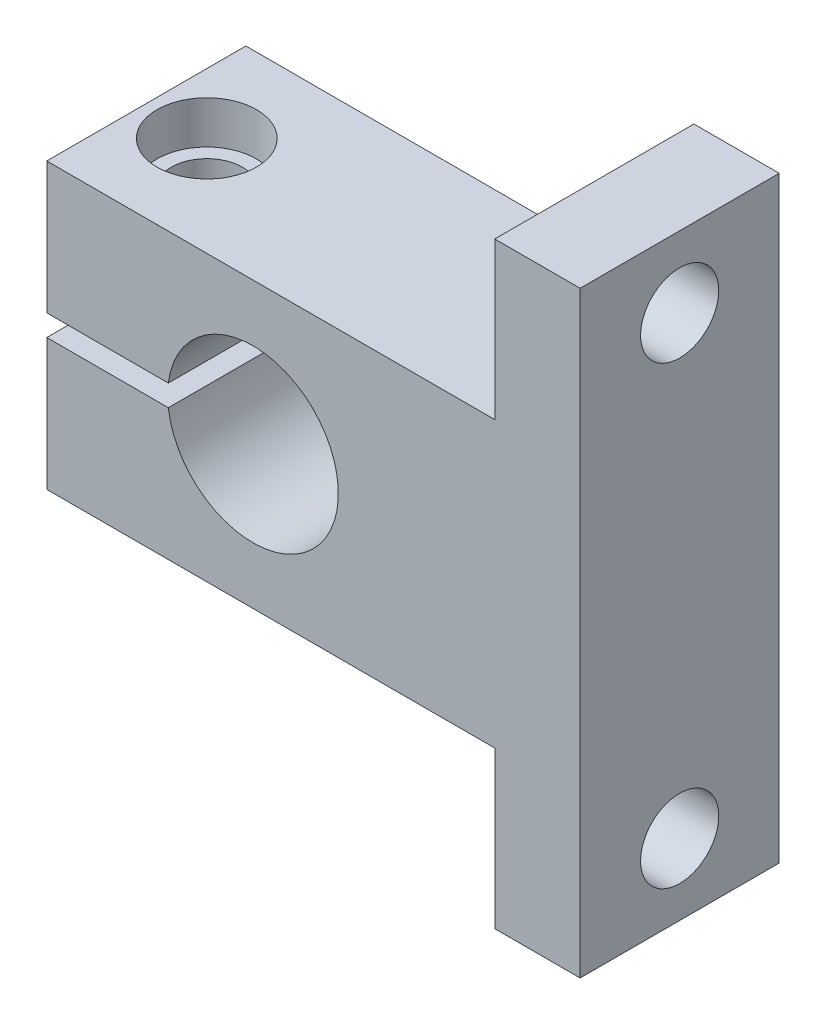
ISO-10303-21;
HEADER;
FILE_DESCRIPTION(('STEP AP214'),'2;1');
FILE_NAME('part.step','',(''),(''),'','','');
FILE_SCHEMA(('AUTOMOTIVE_DESIGN { 1 0 10303 214 1 1 1 1 }'));
ENDSEC;
DATA;
#1=APPLICATION_CONTEXT('core data for automotive mechanical design processes');
#2=APPLICATION_PROTOCOL_DEFINITION('international standard','automotive_design',2000,#1);
#3=PRODUCT_CONTEXT('',#1,'mechanical');
#4=PRODUCT('Part','Part','',(#3));
#5=PRODUCT_RELATED_PRODUCT_CATEGORY('part','',(#4));
#6=PRODUCT_DEFINITION_FORMATION('','',#4);
#7=PRODUCT_DEFINITION_CONTEXT('part definition',#1,'design');
#8=PRODUCT_DEFINITION('design','',#6,#7);
#9=PRODUCT_DEFINITION_SHAPE('','',#8);
#10=(LENGTH_UNIT() NAMED_UNIT(*) SI_UNIT(.MILLI.,.METRE.));
#11=(NAMED_UNIT(*) PLANE_ANGLE_UNIT() SI_UNIT($,.RADIAN.));
#12=(NAMED_UNIT(*) SI_UNIT($,.STERADIAN.) SOLID_ANGLE_UNIT());
#13=UNCERTAINTY_MEASURE_WITH_UNIT(LENGTH_MEASURE(1.E-05),#10,'distance_accuracy_value','');
#14=(GEOMETRIC_REPRESENTATION_CONTEXT(3) GLOBAL_UNCERTAINTY_ASSIGNED_CONTEXT((#13)) GLOBAL_UNIT_ASSIGNED_CONTEXT((#10,
#11,#12)) REPRESENTATION_CONTEXT('',''));
#15=CARTESIAN_POINT('',(0.,0.,0.));
#16=DIRECTION('',(0.,0.,1.));
#17=DIRECTION('',(1.,0.,0.));
#18=AXIS2_PLACEMENT_3D('',#15,#16,#17);
#19=CARTESIAN_POINT('',(-33.25,-0.001000000000001,7.));
#20=DIRECTION('',(0.,1.,0.));
#21=DIRECTION('',(0.,0.,1.));
#22=AXIS2_PLACEMENT_3D('',#19,#20,#21);
#23=CYLINDRICAL_SURFACE('',#22,2.5);
#24=CARTESIAN_POINT('',(-33.25,21.75,7.));
#25=DIRECTION('',(0.,1.,0.));
#26=DIRECTION('',(0.,0.,1.));
#27=AXIS2_PLACEMENT_3D('',#24,#25,#26);
#28=CIRCLE('',#27,2.5);
#29=CARTESIAN_POINT('',(-33.25,21.75,9.5));
#30=VERTEX_POINT('',#29);
#31=EDGE_CURVE('E165',#30,#30,#28,.F.);
#32=ORIENTED_EDGE('',*,*,#31,.T.);
#33=EDGE_LOOP('',(#32));
#34=FACE_BOUND('',#33,.T.);
#35=CARTESIAN_POINT('',(-33.25,28.,7.));
#36=DIRECTION('',(0.,1.,0.));
#37=DIRECTION('',(0.,0.,1.));
#38=AXIS2_PLACEMENT_3D('',#35,#36,#37);
#39=CIRCLE('',#38,2.5);
#40=CARTESIAN_POINT('',(-33.25,28.,9.5));
#41=VERTEX_POINT('',#40);
#42=EDGE_CURVE('E43',#41,#41,#39,.F.);
#43=ORIENTED_EDGE('',*,*,#42,.F.);
#44=EDGE_LOOP('',(#43));
#45=FACE_BOUND('',#44,.T.);
#46=ADVANCED_FACE('F39',(#34,#45),#23,.F.);
#47=CARTESIAN_POINT('',(-6.,0.,14.));
#48=DIRECTION('',(0.,1.,0.));
#49=DIRECTION('',(0.,0.,1.));
#50=AXIS2_PLACEMENT_3D('',#47,#48,#49);
#51=PLANE('',#50);
#52=DIRECTION('',(1.,0.,0.));
#53=VECTOR('',#52,1.);
#54=CARTESIAN_POINT('',(-6.,0.,0.));
#55=LINE('',#54,#53);
#56=CARTESIAN_POINT('',(-6.,0.,0.));
#57=VERTEX_POINT('',#56);
#58=CARTESIAN_POINT('',(0.,0.,0.));
#59=VERTEX_POINT('',#58);
#60=EDGE_CURVE('E161',#57,#59,#55,.T.);
#61=ORIENTED_EDGE('',*,*,#60,.T.);
#62=DIRECTION('',(0.,0.,-1.));
#63=VECTOR('',#62,1.);
#64=CARTESIAN_POINT('',(0.,0.,14.));
#65=LINE('',#64,#63);
#66=CARTESIAN_POINT('',(0.,0.,14.));
#67=VERTEX_POINT('',#66);
#68=EDGE_CURVE('E11',#67,#59,#65,.T.);
#69=ORIENTED_EDGE('',*,*,#68,.F.);
#70=DIRECTION('',(1.,0.,0.));
#71=VECTOR('',#70,1.);
#72=CARTESIAN_POINT('',(-6.,0.,14.));
#73=LINE('',#72,#71);
#74=CARTESIAN_POINT('',(-6.,0.,14.));
#75=VERTEX_POINT('',#74);
#76=EDGE_CURVE('E184',#75,#67,#73,.T.);
#77=ORIENTED_EDGE('',*,*,#76,.F.);
#78=DIRECTION('',(0.,0.,-1.));
#79=VECTOR('',#78,1.);
#80=CARTESIAN_POINT('',(-6.,0.,14.));
#81=LINE('',#80,#79);
#82=EDGE_CURVE('E157',#75,#57,#81,.T.);
#83=ORIENTED_EDGE('',*,*,#82,.T.);
#84=EDGE_LOOP('',(#61,#69,#77,#83));
#85=FACE_BOUND('',#84,.T.);
#86=ADVANCED_FACE('F41',(#85),#51,.F.);
#87=CARTESIAN_POINT('',(0.,0.,14.));
#88=DIRECTION('',(-1.,0.,0.));
#89=DIRECTION('',(0.,0.,1.));
#90=AXIS2_PLACEMENT_3D('',#87,#88,#89);
#91=PLANE('',#90);
#92=CARTESIAN_POINT('',(0.,5.,7.));
#93=DIRECTION('',(-1.,0.,0.));
#94=DIRECTION('',(0.,-1.,0.));
#95=AXIS2_PLACEMENT_3D('',#92,#93,#94);
#96=CIRCLE('',#95,2.75);
#97=CARTESIAN_POINT('',(0.,2.25,7.));
#98=VERTEX_POINT('',#97);
#99=EDGE_CURVE('E305',#98,#98,#96,.T.);
#100=ORIENTED_EDGE('',*,*,#99,.T.);
#101=EDGE_LOOP('',(#100));
#102=FACE_BOUND('',#101,.T.);
#103=CARTESIAN_POINT('',(0.,37.,7.));
#104=DIRECTION('',(-1.,0.,0.));
#105=DIRECTION('',(0.,-1.,0.));
#106=AXIS2_PLACEMENT_3D('',#103,#104,#105);
#107=CIRCLE('',#106,2.75);
#108=CARTESIAN_POINT('',(0.,34.25,7.));
#109=VERTEX_POINT('',#108);
#110=EDGE_CURVE('E297',#109,#109,#107,.T.);
#111=ORIENTED_EDGE('',*,*,#110,.T.);
#112=EDGE_LOOP('',(#111));
#113=FACE_BOUND('',#112,.T.);
#114=DIRECTION('',(0.,1.,0.));
#115=VECTOR('',#114,1.);
#116=CARTESIAN_POINT('',(0.,0.,0.));
#117=LINE('',#116,#115);
#118=CARTESIAN_POINT('',(0.,42.,0.));
#119=VERTEX_POINT('',#118);
#120=EDGE_CURVE('E164',#59,#119,#117,.T.);
#121=ORIENTED_EDGE('',*,*,#120,.T.);
#122=DIRECTION('',(0.,0.,-1.));
#123=VECTOR('',#122,1.);
#124=CARTESIAN_POINT('',(0.,42.,14.));
#125=LINE('',#124,#123);
#126=CARTESIAN_POINT('',(0.,42.,14.));
#127=VERTEX_POINT('',#126);
#128=EDGE_CURVE('E49',#127,#119,#125,.T.);
#129=ORIENTED_EDGE('',*,*,#128,.F.);
#130=DIRECTION('',(0.,1.,0.));
#131=VECTOR('',#130,1.);
#132=CARTESIAN_POINT('',(0.,0.,14.));
#133=LINE('',#132,#131);
#134=EDGE_CURVE('E112',#67,#127,#133,.T.);
#135=ORIENTED_EDGE('',*,*,#134,.F.);
#136=ORIENTED_EDGE('',*,*,#68,.T.);
#137=EDGE_LOOP('',(#121,#129,#135,#136));
#138=FACE_BOUND('',#137,.T.);
#139=ADVANCED_FACE('F271',(#102,#113,#138),#91,.F.);
#140=CARTESIAN_POINT('',(0.,42.,14.));
#141=DIRECTION('',(0.,-1.,0.));
#142=DIRECTION('',(0.,0.,-1.));
#143=AXIS2_PLACEMENT_3D('',#140,#141,#142);
#144=PLANE('',#143);
#145=DIRECTION('',(-1.,0.,0.));
#146=VECTOR('',#145,1.);
#147=CARTESIAN_POINT('',(0.,42.,0.));
#148=LINE('',#147,#146);
#149=CARTESIAN_POINT('',(-6.,42.,0.));
#150=VERTEX_POINT('',#149);
#151=EDGE_CURVE('E167',#119,#150,#148,.T.);
#152=ORIENTED_EDGE('',*,*,#151,.T.);
#153=DIRECTION('',(0.,0.,-1.));
#154=VECTOR('',#153,1.);
#155=CARTESIAN_POINT('',(-6.,42.,14.));
#156=LINE('',#155,#154);
#157=CARTESIAN_POINT('',(-6.,42.,14.));
#158=VERTEX_POINT('',#157);
#159=EDGE_CURVE('E203',#158,#150,#156,.T.);
#160=ORIENTED_EDGE('',*,*,#159,.F.);
#161=DIRECTION('',(-1.,0.,0.));
#162=VECTOR('',#161,1.);
#163=CARTESIAN_POINT('',(0.,42.,14.));
#164=LINE('',#163,#162);
#165=EDGE_CURVE('E212',#127,#158,#164,.T.);
#166=ORIENTED_EDGE('',*,*,#165,.F.);
#167=ORIENTED_EDGE('',*,*,#128,.T.);
#168=EDGE_LOOP('',(#152,#160,#166,#167));
#169=FACE_BOUND('',#168,.T.);
#170=ADVANCED_FACE('F210',(#169),#144,.F.);
#171=CARTESIAN_POINT('',(-6.,42.,14.));
#172=DIRECTION('',(1.,0.,0.));
#173=DIRECTION('',(0.,1.,0.));
#174=AXIS2_PLACEMENT_3D('',#171,#172,#173);
#175=PLANE('',#174);
#176=CARTESIAN_POINT('',(-6.00000000000001,37.,7.));
#177=DIRECTION('',(-1.,0.,0.));
#178=DIRECTION('',(0.,-1.,0.));
#179=AXIS2_PLACEMENT_3D('',#176,#177,#178);
#180=CIRCLE('',#179,2.75);
#181=CARTESIAN_POINT('',(-6.00000000000001,34.25,7.));
#182=VERTEX_POINT('',#181);
#183=EDGE_CURVE('E302',#182,#182,#180,.T.);
#184=ORIENTED_EDGE('',*,*,#183,.F.);
#185=EDGE_LOOP('',(#184));
#186=FACE_BOUND('',#185,.T.);
#187=DIRECTION('',(0.,-1.,0.));
#188=VECTOR('',#187,1.);
#189=CARTESIAN_POINT('',(-6.,42.,0.));
#190=LINE('',#189,#188);
#191=CARTESIAN_POINT('',(-6.,31.,0.));
#192=VERTEX_POINT('',#191);
#193=EDGE_CURVE('E169',#150,#192,#190,.T.);
#194=ORIENTED_EDGE('',*,*,#193,.T.);
#195=DIRECTION('',(0.,0.,-1.));
#196=VECTOR('',#195,1.);
#197=CARTESIAN_POINT('',(-6.,31.,14.));
#198=LINE('',#197,#196);
#199=CARTESIAN_POINT('',(-6.,31.,14.));
#200=VERTEX_POINT('',#199);
#201=EDGE_CURVE('E200',#200,#192,#198,.T.);
#202=ORIENTED_EDGE('',*,*,#201,.F.);
#203=DIRECTION('',(0.,-1.,0.));
#204=VECTOR('',#203,1.);
#205=CARTESIAN_POINT('',(-6.,42.,14.));
#206=LINE('',#205,#204);
#207=EDGE_CURVE('E230',#158,#200,#206,.T.);
#208=ORIENTED_EDGE('',*,*,#207,.F.);
#209=ORIENTED_EDGE('',*,*,#159,.T.);
#210=EDGE_LOOP('',(#194,#202,#208,#209));
#211=FACE_BOUND('',#210,.T.);
#212=ADVANCED_FACE('F221',(#186,#211),#175,.F.);
#213=CARTESIAN_POINT('',(-6.,31.,14.));
#214=DIRECTION('',(0.,-1.,0.));
#215=DIRECTION('',(1.,0.,0.));
#216=AXIS2_PLACEMENT_3D('',#213,#214,#215);
#217=PLANE('',#216);
#218=CARTESIAN_POINT('',(-33.25,31.,7.));
#219=DIRECTION('',(0.,1.,0.));
#220=DIRECTION('',(0.,0.,1.));
#221=AXIS2_PLACEMENT_3D('',#218,#219,#220);
#222=CIRCLE('',#221,3.5);
#223=CARTESIAN_POINT('',(-33.25,31.,10.5));
#224=VERTEX_POINT('',#223);
#225=EDGE_CURVE('E313',#224,#224,#222,.T.);
#226=ORIENTED_EDGE('',*,*,#225,.F.);
#227=EDGE_LOOP('',(#226));
#228=FACE_BOUND('',#227,.T.);
#229=DIRECTION('',(-1.,0.,0.));
#230=VECTOR('',#229,1.);
#231=CARTESIAN_POINT('',(-6.,31.,0.));
#232=LINE('',#231,#230);
#233=CARTESIAN_POINT('',(-37.5,31.,0.));
#234=VERTEX_POINT('',#233);
#235=EDGE_CURVE('E171',#192,#234,#232,.T.);
#236=ORIENTED_EDGE('',*,*,#235,.T.);
#237=DIRECTION('',(0.,0.,-1.));
#238=VECTOR('',#237,1.);
#239=CARTESIAN_POINT('',(-37.5,31.,14.));
#240=LINE('',#239,#238);
#241=CARTESIAN_POINT('',(-37.5,31.,14.));
#242=VERTEX_POINT('',#241);
#243=EDGE_CURVE('E197',#242,#234,#240,.T.);
#244=ORIENTED_EDGE('',*,*,#243,.F.);
#245=DIRECTION('',(-1.,0.,0.));
#246=VECTOR('',#245,1.);
#247=CARTESIAN_POINT('',(-6.,31.,14.));
#248=LINE('',#247,#246);
#249=EDGE_CURVE('E227',#200,#242,#248,.T.);
#250=ORIENTED_EDGE('',*,*,#249,.F.);
#251=ORIENTED_EDGE('',*,*,#201,.T.);
#252=EDGE_LOOP('',(#236,#244,#250,#251));
#253=FACE_BOUND('',#252,.T.);
#254=ADVANCED_FACE('F225',(#228,#253),#217,.F.);
#255=CARTESIAN_POINT('',(-37.5,31.,14.));
#256=DIRECTION('',(1.,0.,0.));
#257=DIRECTION('',(0.,0.,-1.));
#258=AXIS2_PLACEMENT_3D('',#255,#256,#257);
#259=PLANE('',#258);
#260=DIRECTION('',(0.,-1.,0.));
#261=VECTOR('',#260,1.);
#262=CARTESIAN_POINT('',(-37.5,31.,0.));
#263=LINE('',#262,#261);
#264=CARTESIAN_POINT('',(-37.5,21.75,0.));
#265=VERTEX_POINT('',#264);
#266=EDGE_CURVE('E173',#234,#265,#263,.T.);
#267=ORIENTED_EDGE('',*,*,#266,.T.);
#268=DIRECTION('',(0.,0.,-1.));
#269=VECTOR('',#268,1.);
#270=CARTESIAN_POINT('',(-37.5,21.75,14.));
#271=LINE('',#270,#269);
#272=CARTESIAN_POINT('',(-37.5,21.75,14.));
#273=VERTEX_POINT('',#272);
#274=EDGE_CURVE('E194',#273,#265,#271,.T.);
#275=ORIENTED_EDGE('',*,*,#274,.F.);
#276=DIRECTION('',(0.,-1.,0.));
#277=VECTOR('',#276,1.);
#278=CARTESIAN_POINT('',(-37.5,31.,14.));
#279=LINE('',#278,#277);
#280=EDGE_CURVE('E229',#242,#273,#279,.T.);
#281=ORIENTED_EDGE('',*,*,#280,.F.);
#282=ORIENTED_EDGE('',*,*,#243,.T.);
#283=EDGE_LOOP('',(#267,#275,#281,#282));
#284=FACE_BOUND('',#283,.T.);
#285=ADVANCED_FACE('F352',(#284),#259,.F.);
#286=CARTESIAN_POINT('',(-37.5,21.75,14.));
#287=DIRECTION('',(0.,1.,0.));
#288=DIRECTION('',(0.,0.,1.));
#289=AXIS2_PLACEMENT_3D('',#286,#287,#288);
#290=PLANE('',#289);
#291=ORIENTED_EDGE('',*,*,#31,.F.);
#292=EDGE_LOOP('',(#291));
#293=FACE_BOUND('',#292,.T.);
#294=DIRECTION('',(1.,0.,0.));
#295=VECTOR('',#294,1.);
#296=CARTESIAN_POINT('',(-37.5,21.75,0.));
#297=LINE('',#296,#295);
#298=CARTESIAN_POINT('',(-28.9529404498953,21.75,0.));
#299=VERTEX_POINT('',#298);
#300=EDGE_CURVE('E175',#265,#299,#297,.T.);
#301=ORIENTED_EDGE('',*,*,#300,.T.);
#302=DIRECTION('',(0.,0.,-1.));
#303=VECTOR('',#302,1.);
#304=CARTESIAN_POINT('',(-28.9529404498953,21.75,14.));
#305=LINE('',#304,#303);
#306=CARTESIAN_POINT('',(-28.9529404498953,21.75,14.));
#307=VERTEX_POINT('',#306);
#308=EDGE_CURVE('E191',#307,#299,#305,.T.);
#309=ORIENTED_EDGE('',*,*,#308,.F.);
#310=DIRECTION('',(1.,0.,0.));
#311=VECTOR('',#310,1.);
#312=CARTESIAN_POINT('',(-37.5,21.75,14.));
#313=LINE('',#312,#311);
#314=EDGE_CURVE('E232',#273,#307,#313,.T.);
#315=ORIENTED_EDGE('',*,*,#314,.F.);
#316=ORIENTED_EDGE('',*,*,#274,.T.);
#317=EDGE_LOOP('',(#301,#309,#315,#316));
#318=FACE_BOUND('',#317,.T.);
#319=ADVANCED_FACE('F359',(#293,#318),#290,.F.);
#320=CARTESIAN_POINT('',(-23.,21.,14.));
#321=DIRECTION('',(0.,0.,-1.));
#322=DIRECTION('',(-1.,0.,0.));
#323=AXIS2_PLACEMENT_3D('',#320,#321,#322);
#324=CYLINDRICAL_SURFACE('',#323,6.);
#325=CARTESIAN_POINT('',(-23.,21.,0.));
#326=DIRECTION('',(0.,0.,-1.));
#327=DIRECTION('',(1.,0.,0.));
#328=AXIS2_PLACEMENT_3D('',#325,#326,#327);
#329=CIRCLE('',#328,6.);
#330=CARTESIAN_POINT('',(-28.9529404498953,20.25,0.));
#331=VERTEX_POINT('',#330);
#332=EDGE_CURVE('E177',#299,#331,#329,.T.);
#333=ORIENTED_EDGE('',*,*,#332,.T.);
#334=DIRECTION('',(0.,0.,-1.));
#335=VECTOR('',#334,1.);
#336=CARTESIAN_POINT('',(-28.9529404498953,20.25,14.));
#337=LINE('',#336,#335);
#338=CARTESIAN_POINT('',(-28.9529404498953,20.25,14.));
#339=VERTEX_POINT('',#338);
#340=EDGE_CURVE('E188',#339,#331,#337,.T.);
#341=ORIENTED_EDGE('',*,*,#340,.F.);
#342=CARTESIAN_POINT('',(-23.,21.,14.));
#343=DIRECTION('',(0.,0.,-1.));
#344=DIRECTION('',(1.,0.,0.));
#345=AXIS2_PLACEMENT_3D('',#342,#343,#344);
#346=CIRCLE('',#345,6.);
#347=EDGE_CURVE('E238',#307,#339,#346,.T.);
#348=ORIENTED_EDGE('',*,*,#347,.F.);
#349=ORIENTED_EDGE('',*,*,#308,.T.);
#350=EDGE_LOOP('',(#333,#341,#348,#349));
#351=FACE_BOUND('',#350,.T.);
#352=ADVANCED_FACE('F244',(#351),#324,.F.);
#353=CARTESIAN_POINT('',(-37.5,20.25,14.));
#354=DIRECTION('',(0.,-1.,0.));
#355=DIRECTION('',(0.,0.,-1.));
#356=AXIS2_PLACEMENT_3D('',#353,#354,#355);
#357=PLANE('',#356);
#358=CARTESIAN_POINT('',(-33.25,20.25,7.));
#359=DIRECTION('',(0.,1.,0.));
#360=DIRECTION('',(0.,0.,1.));
#361=AXIS2_PLACEMENT_3D('',#358,#359,#360);
#362=CIRCLE('',#361,1.65);
#363=CARTESIAN_POINT('',(-33.25,20.25,8.65));
#364=VERTEX_POINT('',#363);
#365=EDGE_CURVE('E291',#364,#364,#362,.T.);
#366=ORIENTED_EDGE('',*,*,#365,.F.);
#367=EDGE_LOOP('',(#366));
#368=FACE_BOUND('',#367,.T.);
#369=DIRECTION('',(-1.,0.,0.));
#370=VECTOR('',#369,1.);
#371=CARTESIAN_POINT('',(-37.5,20.25,0.));
#372=LINE('',#371,#370);
#373=CARTESIAN_POINT('',(-37.5,20.25,0.));
#374=VERTEX_POINT('',#373);
#375=EDGE_CURVE('E179',#331,#374,#372,.T.);
#376=ORIENTED_EDGE('',*,*,#375,.T.);
#377=DIRECTION('',(0.,0.,-1.));
#378=VECTOR('',#377,1.);
#379=CARTESIAN_POINT('',(-37.5,20.25,14.));
#380=LINE('',#379,#378);
#381=CARTESIAN_POINT('',(-37.5,20.25,14.));
#382=VERTEX_POINT('',#381);
#383=EDGE_CURVE('E152',#382,#374,#380,.T.);
#384=ORIENTED_EDGE('',*,*,#383,.F.);
#385=DIRECTION('',(-1.,0.,0.));
#386=VECTOR('',#385,1.);
#387=CARTESIAN_POINT('',(-37.5,20.25,14.));
#388=LINE('',#387,#386);
#389=EDGE_CURVE('E143',#339,#382,#388,.T.);
#390=ORIENTED_EDGE('',*,*,#389,.F.);
#391=ORIENTED_EDGE('',*,*,#340,.T.);
#392=EDGE_LOOP('',(#376,#384,#390,#391));
#393=FACE_BOUND('',#392,.T.);
#394=ADVANCED_FACE('F248',(#368,#393),#357,.F.);
#395=CARTESIAN_POINT('',(-37.5,20.25,14.));
#396=DIRECTION('',(1.,0.,0.));
#397=DIRECTION('',(0.,0.,-1.));
#398=AXIS2_PLACEMENT_3D('',#395,#396,#397);
#399=PLANE('',#398);
#400=DIRECTION('',(0.,-1.,0.));
#401=VECTOR('',#400,1.);
#402=CARTESIAN_POINT('',(-37.5,20.25,0.));
#403=LINE('',#402,#401);
#404=CARTESIAN_POINT('',(-37.5,11.,0.));
#405=VERTEX_POINT('',#404);
#406=EDGE_CURVE('E151',#374,#405,#403,.T.);
#407=ORIENTED_EDGE('',*,*,#406,.T.);
#408=DIRECTION('',(0.,0.,-1.));
#409=VECTOR('',#408,1.);
#410=CARTESIAN_POINT('',(-37.5,11.,14.));
#411=LINE('',#410,#409);
#412=CARTESIAN_POINT('',(-37.5,11.,14.));
#413=VERTEX_POINT('',#412);
#414=EDGE_CURVE('E148',#413,#405,#411,.T.);
#415=ORIENTED_EDGE('',*,*,#414,.F.);
#416=DIRECTION('',(0.,-1.,0.));
#417=VECTOR('',#416,1.);
#418=CARTESIAN_POINT('',(-37.5,20.25,14.));
#419=LINE('',#418,#417);
#420=EDGE_CURVE('E137',#382,#413,#419,.T.);
#421=ORIENTED_EDGE('',*,*,#420,.F.);
#422=ORIENTED_EDGE('',*,*,#383,.T.);
#423=EDGE_LOOP('',(#407,#415,#421,#422));
#424=FACE_BOUND('',#423,.T.);
#425=ADVANCED_FACE('F149',(#424),#399,.F.);
#426=CARTESIAN_POINT('',(-37.5,11.,14.));
#427=DIRECTION('',(0.,1.,0.));
#428=DIRECTION('',(0.,0.,1.));
#429=AXIS2_PLACEMENT_3D('',#426,#427,#428);
#430=PLANE('',#429);
#431=CARTESIAN_POINT('',(-33.25,11.,7.));
#432=DIRECTION('',(0.,1.,0.));
#433=DIRECTION('',(0.,0.,1.));
#434=AXIS2_PLACEMENT_3D('',#431,#432,#433);
#435=CIRCLE('',#434,1.65);
#436=CARTESIAN_POINT('',(-33.25,11.,8.65));
#437=VERTEX_POINT('',#436);
#438=EDGE_CURVE('E294',#437,#437,#435,.T.);
#439=ORIENTED_EDGE('',*,*,#438,.T.);
#440=EDGE_LOOP('',(#439));
#441=FACE_BOUND('',#440,.T.);
#442=DIRECTION('',(1.,0.,0.));
#443=VECTOR('',#442,1.);
#444=CARTESIAN_POINT('',(-37.5,11.,0.));
#445=LINE('',#444,#443);
#446=CARTESIAN_POINT('',(-6.,11.,0.));
#447=VERTEX_POINT('',#446);
#448=EDGE_CURVE('E98',#405,#447,#445,.T.);
#449=ORIENTED_EDGE('',*,*,#448,.T.);
#450=DIRECTION('',(0.,0.,-1.));
#451=VECTOR('',#450,1.);
#452=CARTESIAN_POINT('',(-6.,11.,14.));
#453=LINE('',#452,#451);
#454=CARTESIAN_POINT('',(-6.,11.,14.));
#455=VERTEX_POINT('',#454);
#456=EDGE_CURVE('E153',#455,#447,#453,.T.);
#457=ORIENTED_EDGE('',*,*,#456,.F.);
#458=DIRECTION('',(1.,0.,0.));
#459=VECTOR('',#458,1.);
#460=CARTESIAN_POINT('',(-37.5,11.,14.));
#461=LINE('',#460,#459);
#462=EDGE_CURVE('E141',#413,#455,#461,.T.);
#463=ORIENTED_EDGE('',*,*,#462,.F.);
#464=ORIENTED_EDGE('',*,*,#414,.T.);
#465=EDGE_LOOP('',(#449,#457,#463,#464));
#466=FACE_BOUND('',#465,.T.);
#467=ADVANCED_FACE('F155',(#441,#466),#430,.F.);
#468=CARTESIAN_POINT('',(-6.,11.,14.));
#469=DIRECTION('',(1.,0.,0.));
#470=DIRECTION('',(0.,1.,0.));
#471=AXIS2_PLACEMENT_3D('',#468,#469,#470);
#472=PLANE('',#471);
#473=CARTESIAN_POINT('',(-6.,5.,7.));
#474=DIRECTION('',(-1.,0.,0.));
#475=DIRECTION('',(0.,-1.,0.));
#476=AXIS2_PLACEMENT_3D('',#473,#474,#475);
#477=CIRCLE('',#476,2.75);
#478=CARTESIAN_POINT('',(-6.,2.25,7.));
#479=VERTEX_POINT('',#478);
#480=EDGE_CURVE('E308',#479,#479,#477,.T.);
#481=ORIENTED_EDGE('',*,*,#480,.F.);
#482=EDGE_LOOP('',(#481));
#483=FACE_BOUND('',#482,.T.);
#484=DIRECTION('',(0.,-1.,0.));
#485=VECTOR('',#484,1.);
#486=CARTESIAN_POINT('',(-6.,11.,0.));
#487=LINE('',#486,#485);
#488=EDGE_CURVE('E104',#447,#57,#487,.T.);
#489=ORIENTED_EDGE('',*,*,#488,.T.);
#490=ORIENTED_EDGE('',*,*,#82,.F.);
#491=DIRECTION('',(0.,-1.,0.));
#492=VECTOR('',#491,1.);
#493=CARTESIAN_POINT('',(-6.,11.,14.));
#494=LINE('',#493,#492);
#495=EDGE_CURVE('E57',#455,#75,#494,.T.);
#496=ORIENTED_EDGE('',*,*,#495,.F.);
#497=ORIENTED_EDGE('',*,*,#456,.T.);
#498=EDGE_LOOP('',(#489,#490,#496,#497));
#499=FACE_BOUND('',#498,.T.);
#500=ADVANCED_FACE('F252',(#483,#499),#472,.F.);
#501=CARTESIAN_POINT('',(-23.,21.,14.));
#502=DIRECTION('',(0.,0.,1.));
#503=DIRECTION('',(1.,0.,0.));
#504=AXIS2_PLACEMENT_3D('',#501,#502,#503);
#505=PLANE('',#504);
#506=ORIENTED_EDGE('',*,*,#76,.T.);
#507=ORIENTED_EDGE('',*,*,#134,.T.);
#508=ORIENTED_EDGE('',*,*,#165,.T.);
#509=ORIENTED_EDGE('',*,*,#207,.T.);
#510=ORIENTED_EDGE('',*,*,#249,.T.);
#511=ORIENTED_EDGE('',*,*,#280,.T.);
#512=ORIENTED_EDGE('',*,*,#314,.T.);
#513=ORIENTED_EDGE('',*,*,#347,.T.);
#514=ORIENTED_EDGE('',*,*,#389,.T.);
#515=ORIENTED_EDGE('',*,*,#420,.T.);
#516=ORIENTED_EDGE('',*,*,#462,.T.);
#517=ORIENTED_EDGE('',*,*,#495,.T.);
#518=EDGE_LOOP('',(#506,#507,#508,#509,#510,#511,#512,#513,#514,#515,#516,#517));
#519=FACE_BOUND('',#518,.T.);
#520=ADVANCED_FACE('F139',(#519),#505,.T.);
#521=CARTESIAN_POINT('',(-23.,21.,0.));
#522=DIRECTION('',(0.,0.,1.));
#523=DIRECTION('',(1.,0.,0.));
#524=AXIS2_PLACEMENT_3D('',#521,#522,#523);
#525=PLANE('',#524);
#526=ORIENTED_EDGE('',*,*,#60,.F.);
#527=ORIENTED_EDGE('',*,*,#488,.F.);
#528=ORIENTED_EDGE('',*,*,#448,.F.);
#529=ORIENTED_EDGE('',*,*,#406,.F.);
#530=ORIENTED_EDGE('',*,*,#375,.F.);
#531=ORIENTED_EDGE('',*,*,#332,.F.);
#532=ORIENTED_EDGE('',*,*,#300,.F.);
#533=ORIENTED_EDGE('',*,*,#266,.F.);
#534=ORIENTED_EDGE('',*,*,#235,.F.);
#535=ORIENTED_EDGE('',*,*,#193,.F.);
#536=ORIENTED_EDGE('',*,*,#151,.F.);
#537=ORIENTED_EDGE('',*,*,#120,.F.);
#538=EDGE_LOOP('',(#526,#527,#528,#529,#530,#531,#532,#533,#534,#535,#536,#537));
#539=FACE_BOUND('',#538,.T.);
#540=ADVANCED_FACE('F216',(#539),#525,.F.);
#541=CARTESIAN_POINT('',(-33.25,20.25,7.));
#542=DIRECTION('',(0.,1.,0.));
#543=DIRECTION('',(0.,0.,1.));
#544=AXIS2_PLACEMENT_3D('',#541,#542,#543);
#545=CYLINDRICAL_SURFACE('',#544,1.65);
#546=ORIENTED_EDGE('',*,*,#365,.T.);
#547=EDGE_LOOP('',(#546));
#548=FACE_BOUND('',#547,.T.);
#549=ORIENTED_EDGE('',*,*,#438,.F.);
#550=EDGE_LOOP('',(#549));
#551=FACE_BOUND('',#550,.T.);
#552=ADVANCED_FACE('F275',(#548,#551),#545,.F.);
#553=CARTESIAN_POINT('',(0.,37.,7.));
#554=DIRECTION('',(-1.,0.,0.));
#555=DIRECTION('',(0.,-1.,0.));
#556=AXIS2_PLACEMENT_3D('',#553,#554,#555);
#557=CYLINDRICAL_SURFACE('',#556,2.75);
#558=ORIENTED_EDGE('',*,*,#110,.F.);
#559=EDGE_LOOP('',(#558));
#560=FACE_BOUND('',#559,.T.);
#561=ORIENTED_EDGE('',*,*,#183,.T.);
#562=EDGE_LOOP('',(#561));
#563=FACE_BOUND('',#562,.T.);
#564=ADVANCED_FACE('F281',(#560,#563),#557,.F.);
#565=CARTESIAN_POINT('',(0.,5.,7.));
#566=DIRECTION('',(-1.,0.,0.));
#567=DIRECTION('',(0.,-1.,0.));
#568=AXIS2_PLACEMENT_3D('',#565,#566,#567);
#569=CYLINDRICAL_SURFACE('',#568,2.75);
#570=ORIENTED_EDGE('',*,*,#99,.F.);
#571=EDGE_LOOP('',(#570));
#572=FACE_BOUND('',#571,.T.);
#573=ORIENTED_EDGE('',*,*,#480,.T.);
#574=EDGE_LOOP('',(#573));
#575=FACE_BOUND('',#574,.T.);
#576=ADVANCED_FACE('F286',(#572,#575),#569,.F.);
#577=CARTESIAN_POINT('',(-33.25,28.,7.));
#578=DIRECTION('',(0.,1.,0.));
#579=DIRECTION('',(0.,0.,1.));
#580=AXIS2_PLACEMENT_3D('',#577,#578,#579);
#581=PLANE('',#580);
#582=CARTESIAN_POINT('',(-33.25,28.,7.));
#583=DIRECTION('',(0.,1.,0.));
#584=DIRECTION('',(0.,0.,1.));
#585=AXIS2_PLACEMENT_3D('',#582,#583,#584);
#586=CIRCLE('',#585,3.5);
#587=CARTESIAN_POINT('',(-33.25,28.,10.5));
#588=VERTEX_POINT('',#587);
#589=EDGE_CURVE('E316',#588,#588,#586,.T.);
#590=ORIENTED_EDGE('',*,*,#589,.T.);
#591=EDGE_LOOP('',(#590));
#592=FACE_BOUND('',#591,.T.);
#593=ORIENTED_EDGE('',*,*,#42,.T.);
#594=EDGE_LOOP('',(#593));
#595=FACE_BOUND('',#594,.T.);
#596=ADVANCED_FACE('F323',(#592,#595),#581,.T.);
#597=CARTESIAN_POINT('',(-33.25,28.,7.));
#598=DIRECTION('',(0.,1.,0.));
#599=DIRECTION('',(0.,0.,1.));
#600=AXIS2_PLACEMENT_3D('',#597,#598,#599);
#601=CYLINDRICAL_SURFACE('',#600,3.5);
#602=ORIENTED_EDGE('',*,*,#589,.F.);
#603=EDGE_LOOP('',(#602));
#604=FACE_BOUND('',#603,.T.);
#605=ORIENTED_EDGE('',*,*,#225,.T.);
#606=EDGE_LOOP('',(#605));
#607=FACE_BOUND('',#606,.T.);
#608=ADVANCED_FACE('F325',(#604,#607),#601,.F.);
#609=CLOSED_SHELL('',(#46,#86,#139,#170,#212,#254,#285,#319,#352,#394,#425,#467,#500,#520,#540,
#552,#564,#576,#596,#608));
#610=MANIFOLD_SOLID_BREP('B2',#609);
#611=ADVANCED_BREP_SHAPE_REPRESENTATION('',(#18,#610),#14);
#612=SHAPE_DEFINITION_REPRESENTATION(#9,#611);
ENDSEC;
END-ISO-10303-21;
